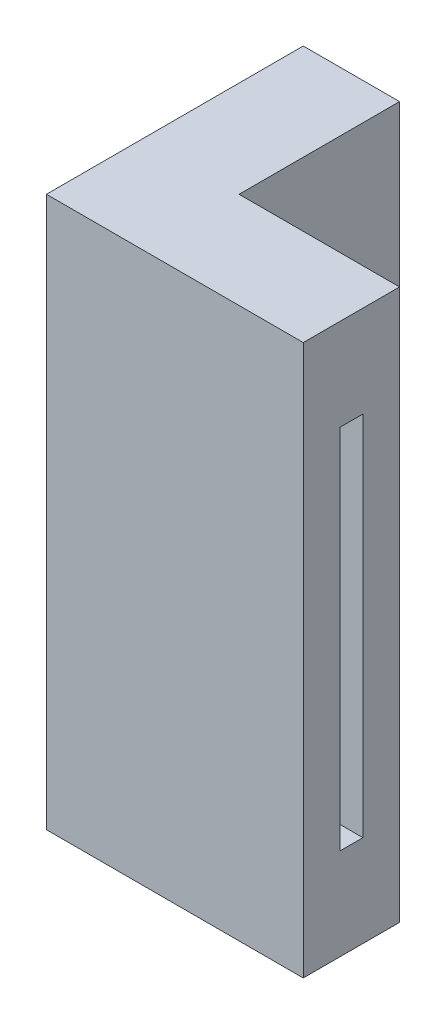
ISO-10303-21;
HEADER;
FILE_DESCRIPTION(('STEP AP214'),'2;1');
FILE_NAME('part.step','',(''),(''),'','','');
FILE_SCHEMA(('AUTOMOTIVE_DESIGN { 1 0 10303 214 1 1 1 1 }'));
ENDSEC;
DATA;
#1=APPLICATION_CONTEXT('core data for automotive mechanical design processes');
#2=APPLICATION_PROTOCOL_DEFINITION('international standard','automotive_design',2000,#1);
#3=PRODUCT_CONTEXT('',#1,'mechanical');
#4=PRODUCT('Part','Part','',(#3));
#5=PRODUCT_RELATED_PRODUCT_CATEGORY('part','',(#4));
#6=PRODUCT_DEFINITION_FORMATION('','',#4);
#7=PRODUCT_DEFINITION_CONTEXT('part definition',#1,'design');
#8=PRODUCT_DEFINITION('design','',#6,#7);
#9=PRODUCT_DEFINITION_SHAPE('','',#8);
#10=(LENGTH_UNIT() NAMED_UNIT(*) SI_UNIT(.MILLI.,.METRE.));
#11=(NAMED_UNIT(*) PLANE_ANGLE_UNIT() SI_UNIT($,.RADIAN.));
#12=(NAMED_UNIT(*) SI_UNIT($,.STERADIAN.) SOLID_ANGLE_UNIT());
#13=UNCERTAINTY_MEASURE_WITH_UNIT(LENGTH_MEASURE(1.E-05),#10,'distance_accuracy_value','');
#14=(GEOMETRIC_REPRESENTATION_CONTEXT(3) GLOBAL_UNCERTAINTY_ASSIGNED_CONTEXT((#13)) GLOBAL_UNIT_ASSIGNED_CONTEXT((#10,
#11,#12)) REPRESENTATION_CONTEXT('',''));
#15=CARTESIAN_POINT('',(0.,0.,0.));
#16=DIRECTION('',(0.,0.,1.));
#17=DIRECTION('',(1.,0.,0.));
#18=AXIS2_PLACEMENT_3D('',#15,#16,#17);
#19=CARTESIAN_POINT('',(0.,76.2,0.));
#20=DIRECTION('',(1.,0.,0.));
#21=DIRECTION('',(0.,0.,-1.));
#22=AXIS2_PLACEMENT_3D('',#19,#20,#21);
#23=PLANE('',#22);
#24=DIRECTION('',(0.,-1.,0.));
#25=VECTOR('',#24,1.);
#26=CARTESIAN_POINT('',(0.,76.2,-30.48));
#27=LINE('',#26,#25);
#28=CARTESIAN_POINT('',(0.,63.5,-30.48));
#29=VERTEX_POINT('',#28);
#30=CARTESIAN_POINT('',(0.,12.7,-30.48));
#31=VERTEX_POINT('',#30);
#32=EDGE_CURVE('E12',#29,#31,#27,.T.);
#33=ORIENTED_EDGE('',*,*,#32,.F.);
#34=DIRECTION('',(0.,0.,1.));
#35=VECTOR('',#34,1.);
#36=CARTESIAN_POINT('',(0.,63.5,0.));
#37=LINE('',#36,#35);
#38=CARTESIAN_POINT('',(0.,63.5,0.));
#39=VERTEX_POINT('',#38);
#40=EDGE_CURVE('E170',#29,#39,#37,.T.);
#41=ORIENTED_EDGE('',*,*,#40,.T.);
#42=DIRECTION('',(0.,-1.,0.));
#43=VECTOR('',#42,1.);
#44=CARTESIAN_POINT('',(0.,76.2,0.));
#45=LINE('',#44,#43);
#46=CARTESIAN_POINT('',(0.,12.7,0.));
#47=VERTEX_POINT('',#46);
#48=EDGE_CURVE('E195',#39,#47,#45,.T.);
#49=ORIENTED_EDGE('',*,*,#48,.T.);
#50=DIRECTION('',(0.,0.,1.));
#51=VECTOR('',#50,1.);
#52=CARTESIAN_POINT('',(0.,12.7,0.));
#53=LINE('',#52,#51);
#54=EDGE_CURVE('E193',#31,#47,#53,.T.);
#55=ORIENTED_EDGE('',*,*,#54,.F.);
#56=EDGE_LOOP('',(#33,#41,#49,#55));
#57=FACE_BOUND('',#56,.T.);
#58=ADVANCED_FACE('F81',(#57),#23,.T.);
#59=CARTESIAN_POINT('',(0.,76.2,0.));
#60=DIRECTION('',(0.,0.,1.));
#61=DIRECTION('',(1.,0.,0.));
#62=AXIS2_PLACEMENT_3D('',#59,#60,#61);
#63=PLANE('',#62);
#64=DIRECTION('',(-1.,0.,0.));
#65=VECTOR('',#64,1.);
#66=CARTESIAN_POINT('',(0.,63.5,0.));
#67=LINE('',#66,#65);
#68=CARTESIAN_POINT('',(30.48,63.5,0.));
#69=VERTEX_POINT('',#68);
#70=EDGE_CURVE('E175',#69,#39,#67,.T.);
#71=ORIENTED_EDGE('',*,*,#70,.F.);
#72=DIRECTION('',(0.,-1.,0.));
#73=VECTOR('',#72,1.);
#74=CARTESIAN_POINT('',(30.48,76.2,0.));
#75=LINE('',#74,#73);
#76=CARTESIAN_POINT('',(30.48,12.7,0.));
#77=VERTEX_POINT('',#76);
#78=EDGE_CURVE('E257',#69,#77,#75,.T.);
#79=ORIENTED_EDGE('',*,*,#78,.T.);
#80=DIRECTION('',(1.,0.,0.));
#81=VECTOR('',#80,1.);
#82=CARTESIAN_POINT('',(0.,12.7,0.));
#83=LINE('',#82,#81);
#84=EDGE_CURVE('E200',#47,#77,#83,.T.);
#85=ORIENTED_EDGE('',*,*,#84,.F.);
#86=ORIENTED_EDGE('',*,*,#48,.F.);
#87=EDGE_LOOP('',(#71,#79,#85,#86));
#88=FACE_BOUND('',#87,.T.);
#89=ADVANCED_FACE('F346',(#88),#63,.F.);
#90=CARTESIAN_POINT('',(3.175,76.2,0.));
#91=DIRECTION('',(-1.,0.,0.));
#92=DIRECTION('',(0.,0.,1.));
#93=AXIS2_PLACEMENT_3D('',#90,#91,#92);
#94=PLANE('',#93);
#95=DIRECTION('',(0.,-1.,0.));
#96=VECTOR('',#95,1.);
#97=CARTESIAN_POINT('',(3.175,76.2,-3.175));
#98=LINE('',#97,#96);
#99=CARTESIAN_POINT('',(3.175,63.5,-3.175));
#100=VERTEX_POINT('',#99);
#101=CARTESIAN_POINT('',(3.175,12.7,-3.175));
#102=VERTEX_POINT('',#101);
#103=EDGE_CURVE('E209',#100,#102,#98,.T.);
#104=ORIENTED_EDGE('',*,*,#103,.F.);
#105=DIRECTION('',(0.,0.,-1.));
#106=VECTOR('',#105,1.);
#107=CARTESIAN_POINT('',(3.175,63.5,0.));
#108=LINE('',#107,#106);
#109=CARTESIAN_POINT('',(3.175,63.5,-30.48));
#110=VERTEX_POINT('',#109);
#111=EDGE_CURVE('E96',#100,#110,#108,.T.);
#112=ORIENTED_EDGE('',*,*,#111,.T.);
#113=DIRECTION('',(0.,-1.,0.));
#114=VECTOR('',#113,1.);
#115=CARTESIAN_POINT('',(3.175,76.2,-30.48));
#116=LINE('',#115,#114);
#117=CARTESIAN_POINT('',(3.175,12.7,-30.48));
#118=VERTEX_POINT('',#117);
#119=EDGE_CURVE('E187',#110,#118,#116,.T.);
#120=ORIENTED_EDGE('',*,*,#119,.T.);
#121=DIRECTION('',(0.,0.,1.));
#122=VECTOR('',#121,1.);
#123=CARTESIAN_POINT('',(3.175,12.7,0.));
#124=LINE('',#123,#122);
#125=EDGE_CURVE('E207',#118,#102,#124,.T.);
#126=ORIENTED_EDGE('',*,*,#125,.T.);
#127=EDGE_LOOP('',(#104,#112,#120,#126));
#128=FACE_BOUND('',#127,.T.);
#129=ADVANCED_FACE('F314',(#128),#94,.T.);
#130=CARTESIAN_POINT('',(0.,76.2,-3.175));
#131=DIRECTION('',(0.,0.,1.));
#132=DIRECTION('',(1.,0.,0.));
#133=AXIS2_PLACEMENT_3D('',#130,#131,#132);
#134=PLANE('',#133);
#135=DIRECTION('',(0.,-1.,0.));
#136=VECTOR('',#135,1.);
#137=CARTESIAN_POINT('',(30.48,76.2,-3.175));
#138=LINE('',#137,#136);
#139=CARTESIAN_POINT('',(30.48,63.5,-3.175));
#140=VERTEX_POINT('',#139);
#141=CARTESIAN_POINT('',(30.48,12.7,-3.175));
#142=VERTEX_POINT('',#141);
#143=EDGE_CURVE('E104',#140,#142,#138,.T.);
#144=ORIENTED_EDGE('',*,*,#143,.F.);
#145=DIRECTION('',(-1.,0.,0.));
#146=VECTOR('',#145,1.);
#147=CARTESIAN_POINT('',(0.,63.5,-3.175));
#148=LINE('',#147,#146);
#149=EDGE_CURVE('E313',#140,#100,#148,.T.);
#150=ORIENTED_EDGE('',*,*,#149,.T.);
#151=ORIENTED_EDGE('',*,*,#103,.T.);
#152=DIRECTION('',(1.,0.,0.));
#153=VECTOR('',#152,1.);
#154=CARTESIAN_POINT('',(0.,12.7,-3.175));
#155=LINE('',#154,#153);
#156=EDGE_CURVE('E221',#102,#142,#155,.T.);
#157=ORIENTED_EDGE('',*,*,#156,.T.);
#158=EDGE_LOOP('',(#144,#150,#151,#157));
#159=FACE_BOUND('',#158,.T.);
#160=ADVANCED_FACE('F312',(#159),#134,.T.);
#161=CARTESIAN_POINT('',(0.,76.2,-30.48));
#162=DIRECTION('',(0.,0.,-1.));
#163=DIRECTION('',(-1.,0.,0.));
#164=AXIS2_PLACEMENT_3D('',#161,#162,#163);
#165=PLANE('',#164);
#166=DIRECTION('',(-1.,0.,0.));
#167=VECTOR('',#166,1.);
#168=CARTESIAN_POINT('',(0.,63.5,-30.48));
#169=LINE('',#168,#167);
#170=EDGE_CURVE('E173',#110,#29,#169,.T.);
#171=ORIENTED_EDGE('',*,*,#170,.T.);
#172=ORIENTED_EDGE('',*,*,#32,.T.);
#173=DIRECTION('',(1.,0.,0.));
#174=VECTOR('',#173,1.);
#175=CARTESIAN_POINT('',(0.,12.7,-30.48));
#176=LINE('',#175,#174);
#177=EDGE_CURVE('E201',#31,#118,#176,.T.);
#178=ORIENTED_EDGE('',*,*,#177,.T.);
#179=ORIENTED_EDGE('',*,*,#119,.F.);
#180=EDGE_LOOP('',(#171,#172,#178,#179));
#181=FACE_BOUND('',#180,.T.);
#182=DIRECTION('',(0.,-1.,0.));
#183=VECTOR('',#182,1.);
#184=CARTESIAN_POINT('',(8.255,76.2,-30.48));
#185=LINE('',#184,#183);
#186=CARTESIAN_POINT('',(8.255,76.2,-30.48));
#187=VERTEX_POINT('',#186);
#188=CARTESIAN_POINT('',(8.255,0.,-30.48));
#189=VERTEX_POINT('',#188);
#190=EDGE_CURVE('E273',#187,#189,#185,.T.);
#191=ORIENTED_EDGE('',*,*,#190,.T.);
#192=DIRECTION('',(1.,0.,0.));
#193=VECTOR('',#192,1.);
#194=CARTESIAN_POINT('',(0.,0.,-30.48));
#195=LINE('',#194,#193);
#196=CARTESIAN_POINT('',(-5.08,0.,-30.48));
#197=VERTEX_POINT('',#196);
#198=EDGE_CURVE('E226',#197,#189,#195,.T.);
#199=ORIENTED_EDGE('',*,*,#198,.F.);
#200=DIRECTION('',(0.,-1.,0.));
#201=VECTOR('',#200,1.);
#202=CARTESIAN_POINT('',(-5.08,76.2,-30.48));
#203=LINE('',#202,#201);
#204=CARTESIAN_POINT('',(-5.08,76.2,-30.48));
#205=VERTEX_POINT('',#204);
#206=EDGE_CURVE('E89',#205,#197,#203,.T.);
#207=ORIENTED_EDGE('',*,*,#206,.F.);
#208=DIRECTION('',(1.,0.,0.));
#209=VECTOR('',#208,1.);
#210=CARTESIAN_POINT('',(0.,76.2,-30.48));
#211=LINE('',#210,#209);
#212=EDGE_CURVE('E227',#205,#187,#211,.T.);
#213=ORIENTED_EDGE('',*,*,#212,.T.);
#214=EDGE_LOOP('',(#191,#199,#207,#213));
#215=FACE_BOUND('',#214,.T.);
#216=ADVANCED_FACE('F183',(#181,#215),#165,.T.);
#217=CARTESIAN_POINT('',(-5.08,76.2,0.));
#218=DIRECTION('',(-1.,0.,0.));
#219=DIRECTION('',(0.,0.,1.));
#220=AXIS2_PLACEMENT_3D('',#217,#218,#219);
#221=PLANE('',#220);
#222=ORIENTED_EDGE('',*,*,#206,.T.);
#223=DIRECTION('',(0.,0.,-1.));
#224=VECTOR('',#223,1.);
#225=CARTESIAN_POINT('',(-5.08,0.,0.));
#226=LINE('',#225,#224);
#227=CARTESIAN_POINT('',(-5.08,0.,5.08));
#228=VERTEX_POINT('',#227);
#229=EDGE_CURVE('E244',#228,#197,#226,.T.);
#230=ORIENTED_EDGE('',*,*,#229,.F.);
#231=DIRECTION('',(0.,-1.,0.));
#232=VECTOR('',#231,1.);
#233=CARTESIAN_POINT('',(-5.08,76.2,5.08));
#234=LINE('',#233,#232);
#235=CARTESIAN_POINT('',(-5.08,76.2,5.08));
#236=VERTEX_POINT('',#235);
#237=EDGE_CURVE('E263',#236,#228,#234,.T.);
#238=ORIENTED_EDGE('',*,*,#237,.F.);
#239=DIRECTION('',(0.,0.,-1.));
#240=VECTOR('',#239,1.);
#241=CARTESIAN_POINT('',(-5.08,76.2,0.));
#242=LINE('',#241,#240);
#243=EDGE_CURVE('E230',#236,#205,#242,.T.);
#244=ORIENTED_EDGE('',*,*,#243,.T.);
#245=EDGE_LOOP('',(#222,#230,#238,#244));
#246=FACE_BOUND('',#245,.T.);
#247=ADVANCED_FACE('F269',(#246),#221,.T.);
#248=CARTESIAN_POINT('',(0.,76.2,5.08));
#249=DIRECTION('',(0.,0.,-1.));
#250=DIRECTION('',(-1.,0.,0.));
#251=AXIS2_PLACEMENT_3D('',#248,#249,#250);
#252=PLANE('',#251);
#253=ORIENTED_EDGE('',*,*,#237,.T.);
#254=DIRECTION('',(1.,0.,0.));
#255=VECTOR('',#254,1.);
#256=CARTESIAN_POINT('',(0.,0.,5.08));
#257=LINE('',#256,#255);
#258=CARTESIAN_POINT('',(30.48,0.,5.08));
#259=VERTEX_POINT('',#258);
#260=EDGE_CURVE('E248',#228,#259,#257,.T.);
#261=ORIENTED_EDGE('',*,*,#260,.T.);
#262=DIRECTION('',(0.,-1.,0.));
#263=VECTOR('',#262,1.);
#264=CARTESIAN_POINT('',(30.48,76.2,5.08));
#265=LINE('',#264,#263);
#266=CARTESIAN_POINT('',(30.48,76.2,5.08));
#267=VERTEX_POINT('',#266);
#268=EDGE_CURVE('E260',#267,#259,#265,.T.);
#269=ORIENTED_EDGE('',*,*,#268,.F.);
#270=DIRECTION('',(1.,0.,0.));
#271=VECTOR('',#270,1.);
#272=CARTESIAN_POINT('',(0.,76.2,5.08));
#273=LINE('',#272,#271);
#274=EDGE_CURVE('E235',#236,#267,#273,.T.);
#275=ORIENTED_EDGE('',*,*,#274,.F.);
#276=EDGE_LOOP('',(#253,#261,#269,#275));
#277=FACE_BOUND('',#276,.T.);
#278=ADVANCED_FACE('F283',(#277),#252,.F.);
#279=CARTESIAN_POINT('',(30.48,76.2,0.));
#280=DIRECTION('',(-1.,0.,0.));
#281=DIRECTION('',(0.,0.,1.));
#282=AXIS2_PLACEMENT_3D('',#279,#280,#281);
#283=PLANE('',#282);
#284=ORIENTED_EDGE('',*,*,#78,.F.);
#285=DIRECTION('',(0.,0.,-1.));
#286=VECTOR('',#285,1.);
#287=CARTESIAN_POINT('',(30.48,63.5,0.));
#288=LINE('',#287,#286);
#289=EDGE_CURVE('E189',#69,#140,#288,.T.);
#290=ORIENTED_EDGE('',*,*,#289,.T.);
#291=ORIENTED_EDGE('',*,*,#143,.T.);
#292=DIRECTION('',(0.,0.,-1.));
#293=VECTOR('',#292,1.);
#294=CARTESIAN_POINT('',(30.48,12.7,0.));
#295=LINE('',#294,#293);
#296=EDGE_CURVE('E217',#77,#142,#295,.T.);
#297=ORIENTED_EDGE('',*,*,#296,.F.);
#298=EDGE_LOOP('',(#284,#290,#291,#297));
#299=FACE_BOUND('',#298,.T.);
#300=DIRECTION('',(0.,-1.,0.));
#301=VECTOR('',#300,1.);
#302=CARTESIAN_POINT('',(30.48,76.2,-8.255));
#303=LINE('',#302,#301);
#304=CARTESIAN_POINT('',(30.48,76.2,-8.255));
#305=VERTEX_POINT('',#304);
#306=CARTESIAN_POINT('',(30.48,0.,-8.255));
#307=VERTEX_POINT('',#306);
#308=EDGE_CURVE('E299',#305,#307,#303,.T.);
#309=ORIENTED_EDGE('',*,*,#308,.F.);
#310=DIRECTION('',(0.,0.,-1.));
#311=VECTOR('',#310,1.);
#312=CARTESIAN_POINT('',(30.48,76.2,0.));
#313=LINE('',#312,#311);
#314=EDGE_CURVE('E238',#267,#305,#313,.T.);
#315=ORIENTED_EDGE('',*,*,#314,.F.);
#316=ORIENTED_EDGE('',*,*,#268,.T.);
#317=DIRECTION('',(0.,0.,-1.));
#318=VECTOR('',#317,1.);
#319=CARTESIAN_POINT('',(30.48,0.,0.));
#320=LINE('',#319,#318);
#321=EDGE_CURVE('E231',#259,#307,#320,.T.);
#322=ORIENTED_EDGE('',*,*,#321,.T.);
#323=EDGE_LOOP('',(#309,#315,#316,#322));
#324=FACE_BOUND('',#323,.T.);
#325=ADVANCED_FACE('F310',(#299,#324),#283,.F.);
#326=CARTESIAN_POINT('',(0.,76.2,0.));
#327=DIRECTION('',(0.,1.,0.));
#328=DIRECTION('',(0.,0.,1.));
#329=AXIS2_PLACEMENT_3D('',#326,#327,#328);
#330=PLANE('',#329);
#331=DIRECTION('',(0.,0.,1.));
#332=VECTOR('',#331,1.);
#333=CARTESIAN_POINT('',(8.255,76.2,0.));
#334=LINE('',#333,#332);
#335=CARTESIAN_POINT('',(8.255,76.2,-8.255));
#336=VERTEX_POINT('',#335);
#337=EDGE_CURVE('E290',#187,#336,#334,.T.);
#338=ORIENTED_EDGE('',*,*,#337,.F.);
#339=ORIENTED_EDGE('',*,*,#212,.F.);
#340=ORIENTED_EDGE('',*,*,#243,.F.);
#341=ORIENTED_EDGE('',*,*,#274,.T.);
#342=ORIENTED_EDGE('',*,*,#314,.T.);
#343=DIRECTION('',(-1.,0.,0.));
#344=VECTOR('',#343,1.);
#345=CARTESIAN_POINT('',(0.,76.2,-8.255));
#346=LINE('',#345,#344);
#347=EDGE_CURVE('E323',#305,#336,#346,.T.);
#348=ORIENTED_EDGE('',*,*,#347,.T.);
#349=EDGE_LOOP('',(#338,#339,#340,#341,#342,#348));
#350=FACE_BOUND('',#349,.T.);
#351=ADVANCED_FACE('F288',(#350),#330,.T.);
#352=CARTESIAN_POINT('',(0.,0.,0.));
#353=DIRECTION('',(0.,1.,0.));
#354=DIRECTION('',(0.,0.,1.));
#355=AXIS2_PLACEMENT_3D('',#352,#353,#354);
#356=PLANE('',#355);
#357=CARTESIAN_POINT('',(19.3675,0.,-1.5875));
#358=DIRECTION('',(0.,-1.,0.));
#359=DIRECTION('',(0.,0.,-1.));
#360=AXIS2_PLACEMENT_3D('',#357,#358,#359);
#361=CIRCLE('',#360,2.1);
#362=CARTESIAN_POINT('',(19.3675,0.,-3.6875));
#363=VERTEX_POINT('',#362);
#364=EDGE_CURVE('E389',#363,#363,#361,.T.);
#365=ORIENTED_EDGE('',*,*,#364,.F.);
#366=EDGE_LOOP('',(#365));
#367=FACE_BOUND('',#366,.T.);
#368=CARTESIAN_POINT('',(1.5875,0.,-19.3675));
#369=DIRECTION('',(0.,-1.,0.));
#370=DIRECTION('',(0.,0.,-1.));
#371=AXIS2_PLACEMENT_3D('',#368,#369,#370);
#372=CIRCLE('',#371,2.1);
#373=CARTESIAN_POINT('',(1.5875,0.,-21.4675));
#374=VERTEX_POINT('',#373);
#375=EDGE_CURVE('E399',#374,#374,#372,.T.);
#376=ORIENTED_EDGE('',*,*,#375,.F.);
#377=EDGE_LOOP('',(#376));
#378=FACE_BOUND('',#377,.T.);
#379=DIRECTION('',(-1.,0.,0.));
#380=VECTOR('',#379,1.);
#381=CARTESIAN_POINT('',(0.,0.,-8.255));
#382=LINE('',#381,#380);
#383=CARTESIAN_POINT('',(8.255,0.,-8.255));
#384=VERTEX_POINT('',#383);
#385=EDGE_CURVE('E180',#307,#384,#382,.T.);
#386=ORIENTED_EDGE('',*,*,#385,.F.);
#387=ORIENTED_EDGE('',*,*,#321,.F.);
#388=ORIENTED_EDGE('',*,*,#260,.F.);
#389=ORIENTED_EDGE('',*,*,#229,.T.);
#390=ORIENTED_EDGE('',*,*,#198,.T.);
#391=DIRECTION('',(0.,0.,1.));
#392=VECTOR('',#391,1.);
#393=CARTESIAN_POINT('',(8.255,0.,0.));
#394=LINE('',#393,#392);
#395=EDGE_CURVE('E293',#189,#384,#394,.T.);
#396=ORIENTED_EDGE('',*,*,#395,.T.);
#397=EDGE_LOOP('',(#386,#387,#388,#389,#390,#396));
#398=FACE_BOUND('',#397,.T.);
#399=ADVANCED_FACE('F279',(#367,#378,#398),#356,.F.);
#400=CARTESIAN_POINT('',(0.,12.7,0.));
#401=DIRECTION('',(0.,1.,0.));
#402=DIRECTION('',(0.,0.,1.));
#403=AXIS2_PLACEMENT_3D('',#400,#401,#402);
#404=PLANE('',#403);
#405=ORIENTED_EDGE('',*,*,#177,.F.);
#406=ORIENTED_EDGE('',*,*,#54,.T.);
#407=ORIENTED_EDGE('',*,*,#84,.T.);
#408=ORIENTED_EDGE('',*,*,#296,.T.);
#409=ORIENTED_EDGE('',*,*,#156,.F.);
#410=ORIENTED_EDGE('',*,*,#125,.F.);
#411=EDGE_LOOP('',(#405,#406,#407,#408,#409,#410));
#412=FACE_BOUND('',#411,.T.);
#413=ADVANCED_FACE('F204',(#412),#404,.T.);
#414=CARTESIAN_POINT('',(0.,76.2,-8.255));
#415=DIRECTION('',(0.,0.,1.));
#416=DIRECTION('',(1.,0.,0.));
#417=AXIS2_PLACEMENT_3D('',#414,#415,#416);
#418=PLANE('',#417);
#419=ORIENTED_EDGE('',*,*,#308,.T.);
#420=ORIENTED_EDGE('',*,*,#385,.T.);
#421=DIRECTION('',(0.,-1.,0.));
#422=VECTOR('',#421,1.);
#423=CARTESIAN_POINT('',(8.255,76.2,-8.255));
#424=LINE('',#423,#422);
#425=EDGE_CURVE('E295',#336,#384,#424,.T.);
#426=ORIENTED_EDGE('',*,*,#425,.F.);
#427=ORIENTED_EDGE('',*,*,#347,.F.);
#428=EDGE_LOOP('',(#419,#420,#426,#427));
#429=FACE_BOUND('',#428,.T.);
#430=ADVANCED_FACE('F333',(#429),#418,.F.);
#431=CARTESIAN_POINT('',(8.255,76.2,0.));
#432=DIRECTION('',(1.,0.,0.));
#433=DIRECTION('',(0.,0.,-1.));
#434=AXIS2_PLACEMENT_3D('',#431,#432,#433);
#435=PLANE('',#434);
#436=ORIENTED_EDGE('',*,*,#425,.T.);
#437=ORIENTED_EDGE('',*,*,#395,.F.);
#438=ORIENTED_EDGE('',*,*,#190,.F.);
#439=ORIENTED_EDGE('',*,*,#337,.T.);
#440=EDGE_LOOP('',(#436,#437,#438,#439));
#441=FACE_BOUND('',#440,.T.);
#442=ADVANCED_FACE('F292',(#441),#435,.T.);
#443=CARTESIAN_POINT('',(0.,63.5,0.));
#444=DIRECTION('',(0.,1.,0.));
#445=DIRECTION('',(0.,0.,1.));
#446=AXIS2_PLACEMENT_3D('',#443,#444,#445);
#447=PLANE('',#446);
#448=ORIENTED_EDGE('',*,*,#40,.F.);
#449=ORIENTED_EDGE('',*,*,#170,.F.);
#450=ORIENTED_EDGE('',*,*,#111,.F.);
#451=ORIENTED_EDGE('',*,*,#149,.F.);
#452=ORIENTED_EDGE('',*,*,#289,.F.);
#453=ORIENTED_EDGE('',*,*,#70,.T.);
#454=EDGE_LOOP('',(#448,#449,#450,#451,#452,#453));
#455=FACE_BOUND('',#454,.T.);
#456=ADVANCED_FACE('F172',(#455),#447,.F.);
#457=CARTESIAN_POINT('',(1.5875,6.35,-19.3675));
#458=DIRECTION('',(0.,-1.,0.));
#459=DIRECTION('',(0.,0.,-1.));
#460=AXIS2_PLACEMENT_3D('',#457,#458,#459);
#461=CYLINDRICAL_SURFACE('',#460,2.1);
#462=CARTESIAN_POINT('',(1.5875,6.35,-19.3675));
#463=DIRECTION('',(0.,-1.,0.));
#464=DIRECTION('',(0.,0.,-1.));
#465=AXIS2_PLACEMENT_3D('',#462,#463,#464);
#466=CIRCLE('',#465,2.1);
#467=CARTESIAN_POINT('',(1.5875,6.35,-21.4675));
#468=VERTEX_POINT('',#467);
#469=EDGE_CURVE('E393',#468,#468,#466,.T.);
#470=ORIENTED_EDGE('',*,*,#469,.F.);
#471=EDGE_LOOP('',(#470));
#472=FACE_BOUND('',#471,.T.);
#473=ORIENTED_EDGE('',*,*,#375,.T.);
#474=EDGE_LOOP('',(#473));
#475=FACE_BOUND('',#474,.T.);
#476=ADVANCED_FACE('F369',(#472,#475),#461,.F.);
#477=CARTESIAN_POINT('',(0.,6.35,0.));
#478=DIRECTION('',(0.,-1.,0.));
#479=DIRECTION('',(0.,0.,-1.));
#480=AXIS2_PLACEMENT_3D('',#477,#478,#479);
#481=PLANE('',#480);
#482=ORIENTED_EDGE('',*,*,#469,.T.);
#483=EDGE_LOOP('',(#482));
#484=FACE_BOUND('',#483,.T.);
#485=ADVANCED_FACE('F372',(#484),#481,.T.);
#486=CARTESIAN_POINT('',(19.3675,6.35,-1.5875));
#487=DIRECTION('',(0.,-1.,0.));
#488=DIRECTION('',(0.,0.,-1.));
#489=AXIS2_PLACEMENT_3D('',#486,#487,#488);
#490=CYLINDRICAL_SURFACE('',#489,2.1);
#491=CARTESIAN_POINT('',(19.3675,6.35,-1.5875));
#492=DIRECTION('',(0.,-1.,0.));
#493=DIRECTION('',(0.,0.,-1.));
#494=AXIS2_PLACEMENT_3D('',#491,#492,#493);
#495=CIRCLE('',#494,2.1);
#496=CARTESIAN_POINT('',(19.3675,6.35,-3.6875));
#497=VERTEX_POINT('',#496);
#498=EDGE_CURVE('E190',#497,#497,#495,.T.);
#499=ORIENTED_EDGE('',*,*,#498,.F.);
#500=EDGE_LOOP('',(#499));
#501=FACE_BOUND('',#500,.T.);
#502=ORIENTED_EDGE('',*,*,#364,.T.);
#503=EDGE_LOOP('',(#502));
#504=FACE_BOUND('',#503,.T.);
#505=ADVANCED_FACE('F376',(#501,#504),#490,.F.);
#506=CARTESIAN_POINT('',(0.,6.35,0.));
#507=DIRECTION('',(0.,-1.,0.));
#508=DIRECTION('',(0.,0.,-1.));
#509=AXIS2_PLACEMENT_3D('',#506,#507,#508);
#510=PLANE('',#509);
#511=ORIENTED_EDGE('',*,*,#498,.T.);
#512=EDGE_LOOP('',(#511));
#513=FACE_BOUND('',#512,.T.);
#514=ADVANCED_FACE('F380',(#513),#510,.T.);
#515=CLOSED_SHELL('',(#58,#89,#129,#160,#216,#247,#278,#325,#351,#399,#413,#430,#442,#456,#476,
#485,#505,#514));
#516=MANIFOLD_SOLID_BREP('B2',#515);
#517=ADVANCED_BREP_SHAPE_REPRESENTATION('',(#18,#516),#14);
#518=SHAPE_DEFINITION_REPRESENTATION(#9,#517);
ENDSEC;
END-ISO-10303-21;
